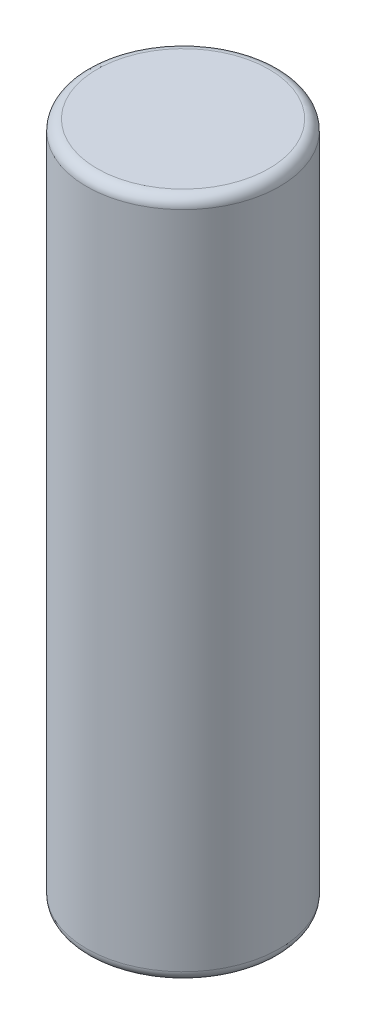
ISO-10303-21;
HEADER;
FILE_DESCRIPTION(('STEP AP214'),'2;1');
FILE_NAME('part.step','',(''),(''),'','','');
FILE_SCHEMA(('AUTOMOTIVE_DESIGN { 1 0 10303 214 1 1 1 1 }'));
ENDSEC;
DATA;
#1=APPLICATION_CONTEXT('core data for automotive mechanical design processes');
#2=APPLICATION_PROTOCOL_DEFINITION('international standard','automotive_design',2000,#1);
#3=PRODUCT_CONTEXT('',#1,'mechanical');
#4=PRODUCT('Part','Part','',(#3));
#5=PRODUCT_RELATED_PRODUCT_CATEGORY('part','',(#4));
#6=PRODUCT_DEFINITION_FORMATION('','',#4);
#7=PRODUCT_DEFINITION_CONTEXT('part definition',#1,'design');
#8=PRODUCT_DEFINITION('design','',#6,#7);
#9=PRODUCT_DEFINITION_SHAPE('','',#8);
#10=(LENGTH_UNIT() NAMED_UNIT(*) SI_UNIT(.MILLI.,.METRE.));
#11=(NAMED_UNIT(*) PLANE_ANGLE_UNIT() SI_UNIT($,.RADIAN.));
#12=(NAMED_UNIT(*) SI_UNIT($,.STERADIAN.) SOLID_ANGLE_UNIT());
#13=UNCERTAINTY_MEASURE_WITH_UNIT(LENGTH_MEASURE(1.E-05),#10,'distance_accuracy_value','');
#14=(GEOMETRIC_REPRESENTATION_CONTEXT(3) GLOBAL_UNCERTAINTY_ASSIGNED_CONTEXT((#13)) GLOBAL_UNIT_ASSIGNED_CONTEXT((#10,
#11,#12)) REPRESENTATION_CONTEXT('',''));
#15=CARTESIAN_POINT('',(0.,0.,0.));
#16=DIRECTION('',(0.,0.,1.));
#17=DIRECTION('',(1.,0.,0.));
#18=AXIS2_PLACEMENT_3D('',#15,#16,#17);
#19=CARTESIAN_POINT('',(0.,32.65,0.));
#20=DIRECTION('',(0.,-1.,0.));
#21=DIRECTION('',(0.,0.,-1.));
#22=AXIS2_PLACEMENT_3D('',#19,#20,#21);
#23=CYLINDRICAL_SURFACE('',#22,9.25);
#24=CARTESIAN_POINT('',(0.,-31.65,0.));
#25=DIRECTION('',(0.,1.,0.));
#26=DIRECTION('',(0.,0.,1.));
#27=AXIS2_PLACEMENT_3D('',#24,#25,#26);
#28=CIRCLE('',#27,9.25);
#29=CARTESIAN_POINT('',(0.,-31.65,9.25));
#30=VERTEX_POINT('',#29);
#31=EDGE_CURVE('E45',#30,#30,#28,.T.);
#32=ORIENTED_EDGE('',*,*,#31,.T.);
#33=EDGE_LOOP('',(#32));
#34=FACE_BOUND('',#33,.T.);
#35=CARTESIAN_POINT('',(0.,31.65,0.));
#36=DIRECTION('',(0.,1.,0.));
#37=DIRECTION('',(0.,0.,1.));
#38=AXIS2_PLACEMENT_3D('',#35,#36,#37);
#39=CIRCLE('',#38,9.25);
#40=CARTESIAN_POINT('',(0.,31.65,9.25));
#41=VERTEX_POINT('',#40);
#42=EDGE_CURVE('E49',#41,#41,#39,.F.);
#43=ORIENTED_EDGE('',*,*,#42,.T.);
#44=EDGE_LOOP('',(#43));
#45=FACE_BOUND('',#44,.T.);
#46=ADVANCED_FACE('F34',(#34,#45),#23,.T.);
#47=CARTESIAN_POINT('',(0.,32.65,0.));
#48=DIRECTION('',(0.,1.,0.));
#49=DIRECTION('',(0.,0.,1.));
#50=AXIS2_PLACEMENT_3D('',#47,#48,#49);
#51=PLANE('',#50);
#52=CARTESIAN_POINT('',(0.,32.65,0.));
#53=DIRECTION('',(0.,1.,0.));
#54=DIRECTION('',(0.,0.,1.));
#55=AXIS2_PLACEMENT_3D('',#52,#53,#54);
#56=CIRCLE('',#55,8.25);
#57=CARTESIAN_POINT('',(0.,32.65,8.25));
#58=VERTEX_POINT('',#57);
#59=EDGE_CURVE('E10',#58,#58,#56,.T.);
#60=ORIENTED_EDGE('',*,*,#59,.T.);
#61=EDGE_LOOP('',(#60));
#62=FACE_BOUND('',#61,.T.);
#63=ADVANCED_FACE('F65',(#62),#51,.T.);
#64=CARTESIAN_POINT('',(0.,-32.65,0.));
#65=DIRECTION('',(0.,1.,0.));
#66=DIRECTION('',(0.,0.,1.));
#67=AXIS2_PLACEMENT_3D('',#64,#65,#66);
#68=PLANE('',#67);
#69=CARTESIAN_POINT('',(0.,-32.65,0.));
#70=DIRECTION('',(0.,1.,0.));
#71=DIRECTION('',(0.,0.,1.));
#72=AXIS2_PLACEMENT_3D('',#69,#70,#71);
#73=CIRCLE('',#72,8.25);
#74=CARTESIAN_POINT('',(0.,-32.65,8.25));
#75=VERTEX_POINT('',#74);
#76=EDGE_CURVE('E41',#75,#75,#73,.F.);
#77=ORIENTED_EDGE('',*,*,#76,.T.);
#78=EDGE_LOOP('',(#77));
#79=FACE_BOUND('',#78,.T.);
#80=ADVANCED_FACE('F62',(#79),#68,.F.);
#81=CARTESIAN_POINT('',(0.,-31.65,0.));
#82=DIRECTION('',(0.,1.,0.));
#83=DIRECTION('',(0.,0.,1.));
#84=AXIS2_PLACEMENT_3D('',#81,#82,#83);
#85=TOROIDAL_SURFACE('',#84,8.25,1.);
#86=ORIENTED_EDGE('',*,*,#76,.F.);
#87=EDGE_LOOP('',(#86));
#88=FACE_BOUND('',#87,.T.);
#89=ORIENTED_EDGE('',*,*,#31,.F.);
#90=EDGE_LOOP('',(#89));
#91=FACE_BOUND('',#90,.T.);
#92=ADVANCED_FACE('F58',(#88,#91),#85,.T.);
#93=CARTESIAN_POINT('',(0.,31.65,0.));
#94=DIRECTION('',(0.,1.,0.));
#95=DIRECTION('',(0.,0.,1.));
#96=AXIS2_PLACEMENT_3D('',#93,#94,#95);
#97=TOROIDAL_SURFACE('',#96,8.25,1.);
#98=ORIENTED_EDGE('',*,*,#42,.F.);
#99=EDGE_LOOP('',(#98));
#100=FACE_BOUND('',#99,.T.);
#101=ORIENTED_EDGE('',*,*,#59,.F.);
#102=EDGE_LOOP('',(#101));
#103=FACE_BOUND('',#102,.T.);
#104=ADVANCED_FACE('F36',(#100,#103),#97,.T.);
#105=CLOSED_SHELL('',(#46,#63,#80,#92,#104));
#106=MANIFOLD_SOLID_BREP('B2',#105);
#107=ADVANCED_BREP_SHAPE_REPRESENTATION('',(#18,#106),#14);
#108=SHAPE_DEFINITION_REPRESENTATION(#9,#107);
ENDSEC;
END-ISO-10303-21;
